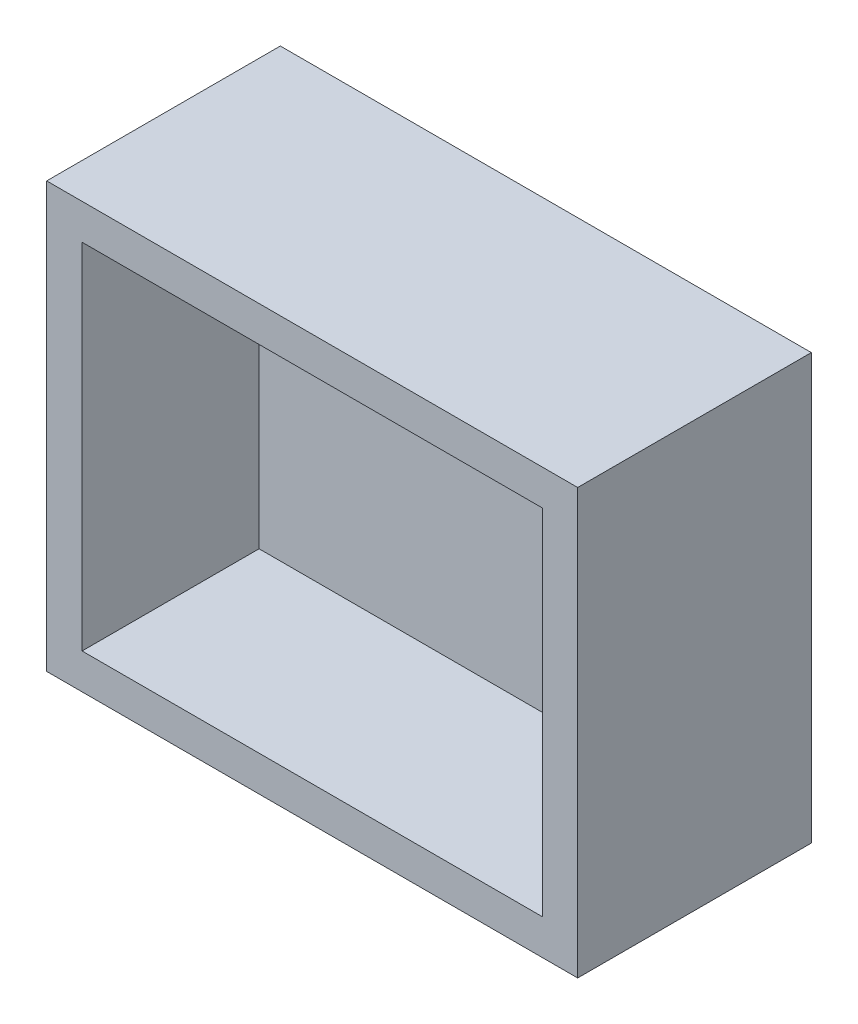
ISO-10303-21;
HEADER;
FILE_DESCRIPTION(('STEP AP214'),'2;1');
FILE_NAME('part.step','',(''),(''),'','','');
FILE_SCHEMA(('AUTOMOTIVE_DESIGN { 1 0 10303 214 1 1 1 1 }'));
ENDSEC;
DATA;
#1=APPLICATION_CONTEXT('core data for automotive mechanical design processes');
#2=APPLICATION_PROTOCOL_DEFINITION('international standard','automotive_design',2000,#1);
#3=PRODUCT_CONTEXT('',#1,'mechanical');
#4=PRODUCT('Part','Part','',(#3));
#5=PRODUCT_RELATED_PRODUCT_CATEGORY('part','',(#4));
#6=PRODUCT_DEFINITION_FORMATION('','',#4);
#7=PRODUCT_DEFINITION_CONTEXT('part definition',#1,'design');
#8=PRODUCT_DEFINITION('design','',#6,#7);
#9=PRODUCT_DEFINITION_SHAPE('','',#8);
#10=(LENGTH_UNIT() NAMED_UNIT(*) SI_UNIT(.MILLI.,.METRE.));
#11=(NAMED_UNIT(*) PLANE_ANGLE_UNIT() SI_UNIT($,.RADIAN.));
#12=(NAMED_UNIT(*) SI_UNIT($,.STERADIAN.) SOLID_ANGLE_UNIT());
#13=UNCERTAINTY_MEASURE_WITH_UNIT(LENGTH_MEASURE(1.E-05),#10,'distance_accuracy_value','');
#14=(GEOMETRIC_REPRESENTATION_CONTEXT(3) GLOBAL_UNCERTAINTY_ASSIGNED_CONTEXT((#13)) GLOBAL_UNIT_ASSIGNED_CONTEXT((#10,
#11,#12)) REPRESENTATION_CONTEXT('',''));
#15=CARTESIAN_POINT('',(0.,0.,0.));
#16=DIRECTION('',(0.,0.,1.));
#17=DIRECTION('',(1.,0.,0.));
#18=AXIS2_PLACEMENT_3D('',#15,#16,#17);
#19=CARTESIAN_POINT('',(0.,0.,-8.));
#20=DIRECTION('',(0.,0.,-1.));
#21=DIRECTION('',(-1.,0.,0.));
#22=AXIS2_PLACEMENT_3D('',#19,#20,#21);
#23=PLANE('',#22);
#24=CARTESIAN_POINT('',(24.,17.5,-8.));
#25=DIRECTION('',(0.,0.,-1.));
#26=DIRECTION('',(-1.,0.,0.));
#27=AXIS2_PLACEMENT_3D('',#24,#25,#26);
#28=CIRCLE('',#27,2.7);
#29=CARTESIAN_POINT('',(21.3,17.5,-8.));
#30=VERTEX_POINT('',#29);
#31=EDGE_CURVE('E358',#30,#30,#28,.T.);
#32=ORIENTED_EDGE('',*,*,#31,.F.);
#33=EDGE_LOOP('',(#32));
#34=FACE_BOUND('',#33,.T.);
#35=CARTESIAN_POINT('',(24.,7.5,-8.));
#36=DIRECTION('',(0.,0.,-1.));
#37=DIRECTION('',(-1.,0.,0.));
#38=AXIS2_PLACEMENT_3D('',#35,#36,#37);
#39=CIRCLE('',#38,2.7);
#40=CARTESIAN_POINT('',(21.3,7.5,-8.));
#41=VERTEX_POINT('',#40);
#42=EDGE_CURVE('E328',#41,#41,#39,.T.);
#43=ORIENTED_EDGE('',*,*,#42,.F.);
#44=EDGE_LOOP('',(#43));
#45=FACE_BOUND('',#44,.T.);
#46=CARTESIAN_POINT('',(-24.,17.5,-8.));
#47=DIRECTION('',(0.,0.,1.));
#48=DIRECTION('',(1.,0.,0.));
#49=AXIS2_PLACEMENT_3D('',#46,#47,#48);
#50=CIRCLE('',#49,2.7);
#51=CARTESIAN_POINT('',(-21.3,17.5,-8.));
#52=VERTEX_POINT('',#51);
#53=EDGE_CURVE('E303',#52,#52,#50,.T.);
#54=ORIENTED_EDGE('',*,*,#53,.T.);
#55=EDGE_LOOP('',(#54));
#56=FACE_BOUND('',#55,.T.);
#57=CARTESIAN_POINT('',(-24.,7.5,-8.));
#58=DIRECTION('',(0.,0.,1.));
#59=DIRECTION('',(1.,0.,0.));
#60=AXIS2_PLACEMENT_3D('',#57,#58,#59);
#61=CIRCLE('',#60,2.7);
#62=CARTESIAN_POINT('',(-21.3,7.5,-8.));
#63=VERTEX_POINT('',#62);
#64=EDGE_CURVE('E320',#63,#63,#61,.T.);
#65=ORIENTED_EDGE('',*,*,#64,.T.);
#66=EDGE_LOOP('',(#65));
#67=FACE_BOUND('',#66,.T.);
#68=DIRECTION('',(0.,1.,0.));
#69=VECTOR('',#68,1.);
#70=CARTESIAN_POINT('',(37.5,-30.,-8.));
#71=LINE('',#70,#69);
#72=CARTESIAN_POINT('',(37.5,-30.,-8.));
#73=VERTEX_POINT('',#72);
#74=CARTESIAN_POINT('',(37.5,30.,-8.));
#75=VERTEX_POINT('',#74);
#76=EDGE_CURVE('E218',#73,#75,#71,.T.);
#77=ORIENTED_EDGE('',*,*,#76,.F.);
#78=DIRECTION('',(1.,0.,0.));
#79=VECTOR('',#78,1.);
#80=CARTESIAN_POINT('',(-37.5,-30.,-8.));
#81=LINE('',#80,#79);
#82=CARTESIAN_POINT('',(-37.5,-30.,-8.));
#83=VERTEX_POINT('',#82);
#84=EDGE_CURVE('E207',#83,#73,#81,.T.);
#85=ORIENTED_EDGE('',*,*,#84,.F.);
#86=DIRECTION('',(0.,-1.,0.));
#87=VECTOR('',#86,1.);
#88=CARTESIAN_POINT('',(-37.5,-30.,-8.));
#89=LINE('',#88,#87);
#90=CARTESIAN_POINT('',(-37.5,30.,-8.));
#91=VERTEX_POINT('',#90);
#92=EDGE_CURVE('E194',#91,#83,#89,.T.);
#93=ORIENTED_EDGE('',*,*,#92,.F.);
#94=DIRECTION('',(-1.,0.,0.));
#95=VECTOR('',#94,1.);
#96=CARTESIAN_POINT('',(-37.5,30.,-8.));
#97=LINE('',#96,#95);
#98=EDGE_CURVE('E212',#75,#91,#97,.T.);
#99=ORIENTED_EDGE('',*,*,#98,.F.);
#100=EDGE_LOOP('',(#77,#85,#93,#99));
#101=FACE_BOUND('',#100,.T.);
#102=DIRECTION('',(0.,-1.,0.));
#103=VECTOR('',#102,1.);
#104=CARTESIAN_POINT('',(28.5,11.25,-8.));
#105=LINE('',#104,#103);
#106=CARTESIAN_POINT('',(28.5,13.75,-8.));
#107=VERTEX_POINT('',#106);
#108=CARTESIAN_POINT('',(28.5,11.25,-8.));
#109=VERTEX_POINT('',#108);
#110=EDGE_CURVE('E361',#107,#109,#105,.T.);
#111=ORIENTED_EDGE('',*,*,#110,.F.);
#112=DIRECTION('',(1.,0.,0.));
#113=VECTOR('',#112,1.);
#114=CARTESIAN_POINT('',(28.5,13.75,-8.));
#115=LINE('',#114,#113);
#116=CARTESIAN_POINT('',(20.,13.75,-8.));
#117=VERTEX_POINT('',#116);
#118=EDGE_CURVE('E337',#117,#107,#115,.T.);
#119=ORIENTED_EDGE('',*,*,#118,.F.);
#120=DIRECTION('',(0.,1.,0.));
#121=VECTOR('',#120,1.);
#122=CARTESIAN_POINT('',(20.,22.5,-8.));
#123=LINE('',#122,#121);
#124=CARTESIAN_POINT('',(20.,22.5,-8.));
#125=VERTEX_POINT('',#124);
#126=EDGE_CURVE('E264',#117,#125,#123,.T.);
#127=ORIENTED_EDGE('',*,*,#126,.T.);
#128=DIRECTION('',(-1.,0.,0.));
#129=VECTOR('',#128,1.);
#130=CARTESIAN_POINT('',(-20.,22.5,-8.));
#131=LINE('',#130,#129);
#132=CARTESIAN_POINT('',(-20.,22.5,-8.));
#133=VERTEX_POINT('',#132);
#134=EDGE_CURVE('E227',#125,#133,#131,.T.);
#135=ORIENTED_EDGE('',*,*,#134,.T.);
#136=DIRECTION('',(0.,-1.,0.));
#137=VECTOR('',#136,1.);
#138=CARTESIAN_POINT('',(-20.,22.5,-8.));
#139=LINE('',#138,#137);
#140=CARTESIAN_POINT('',(-20.,13.75,-8.));
#141=VERTEX_POINT('',#140);
#142=EDGE_CURVE('E269',#133,#141,#139,.T.);
#143=ORIENTED_EDGE('',*,*,#142,.T.);
#144=DIRECTION('',(-1.,0.,0.));
#145=VECTOR('',#144,1.);
#146=CARTESIAN_POINT('',(-28.5,13.75,-8.));
#147=LINE('',#146,#145);
#148=CARTESIAN_POINT('',(-28.5,13.75,-8.));
#149=VERTEX_POINT('',#148);
#150=EDGE_CURVE('E294',#141,#149,#147,.T.);
#151=ORIENTED_EDGE('',*,*,#150,.T.);
#152=DIRECTION('',(0.,-1.,0.));
#153=VECTOR('',#152,1.);
#154=CARTESIAN_POINT('',(-28.5,11.25,-8.));
#155=LINE('',#154,#153);
#156=CARTESIAN_POINT('',(-28.5,11.25,-8.));
#157=VERTEX_POINT('',#156);
#158=EDGE_CURVE('E307',#149,#157,#155,.T.);
#159=ORIENTED_EDGE('',*,*,#158,.T.);
#160=DIRECTION('',(1.,0.,0.));
#161=VECTOR('',#160,1.);
#162=CARTESIAN_POINT('',(-20.,11.25,-8.));
#163=LINE('',#162,#161);
#164=CARTESIAN_POINT('',(-20.,11.25,-8.));
#165=VERTEX_POINT('',#164);
#166=EDGE_CURVE('E278',#157,#165,#163,.T.);
#167=ORIENTED_EDGE('',*,*,#166,.T.);
#168=CARTESIAN_POINT('',(-20.,2.5,-8.));
#169=VERTEX_POINT('',#168);
#170=EDGE_CURVE('E242',#165,#169,#139,.T.);
#171=ORIENTED_EDGE('',*,*,#170,.T.);
#172=DIRECTION('',(1.,0.,0.));
#173=VECTOR('',#172,1.);
#174=CARTESIAN_POINT('',(-20.,2.5,-8.));
#175=LINE('',#174,#173);
#176=CARTESIAN_POINT('',(20.,2.5,-8.));
#177=VERTEX_POINT('',#176);
#178=EDGE_CURVE('E265',#169,#177,#175,.T.);
#179=ORIENTED_EDGE('',*,*,#178,.T.);
#180=CARTESIAN_POINT('',(20.,11.25,-8.));
#181=VERTEX_POINT('',#180);
#182=EDGE_CURVE('E260',#177,#181,#123,.T.);
#183=ORIENTED_EDGE('',*,*,#182,.T.);
#184=DIRECTION('',(-1.,0.,0.));
#185=VECTOR('',#184,1.);
#186=CARTESIAN_POINT('',(20.,11.25,-8.));
#187=LINE('',#186,#185);
#188=EDGE_CURVE('E351',#109,#181,#187,.T.);
#189=ORIENTED_EDGE('',*,*,#188,.F.);
#190=EDGE_LOOP('',(#111,#119,#127,#135,#143,#151,#159,#167,#171,#179,#183,#189));
#191=FACE_BOUND('',#190,.T.);
#192=ADVANCED_FACE('F39',(#34,#45,#56,#67,#101,#191),#23,.T.);
#193=CARTESIAN_POINT('',(20.,22.5,-8.));
#194=DIRECTION('',(1.,0.,0.));
#195=DIRECTION('',(0.,1.,0.));
#196=AXIS2_PLACEMENT_3D('',#193,#194,#195);
#197=PLANE('',#196);
#198=DIRECTION('',(0.,0.,1.));
#199=VECTOR('',#198,1.);
#200=CARTESIAN_POINT('',(20.,13.75,-8.));
#201=LINE('',#200,#199);
#202=CARTESIAN_POINT('',(20.,13.75,0.));
#203=VERTEX_POINT('',#202);
#204=EDGE_CURVE('E324',#117,#203,#201,.T.);
#205=ORIENTED_EDGE('',*,*,#204,.T.);
#206=DIRECTION('',(0.,1.,0.));
#207=VECTOR('',#206,1.);
#208=CARTESIAN_POINT('',(20.,22.5,0.));
#209=LINE('',#208,#207);
#210=CARTESIAN_POINT('',(20.,22.5,0.));
#211=VERTEX_POINT('',#210);
#212=EDGE_CURVE('E247',#203,#211,#209,.T.);
#213=ORIENTED_EDGE('',*,*,#212,.T.);
#214=DIRECTION('',(0.,0.,1.));
#215=VECTOR('',#214,1.);
#216=CARTESIAN_POINT('',(20.,22.5,-8.));
#217=LINE('',#216,#215);
#218=EDGE_CURVE('E231',#125,#211,#217,.T.);
#219=ORIENTED_EDGE('',*,*,#218,.F.);
#220=ORIENTED_EDGE('',*,*,#126,.F.);
#221=EDGE_LOOP('',(#205,#213,#219,#220));
#222=FACE_BOUND('',#221,.T.);
#223=ADVANCED_FACE('F437',(#222),#197,.F.);
#224=DIRECTION('',(0.,0.,1.));
#225=VECTOR('',#224,1.);
#226=CARTESIAN_POINT('',(20.,11.25,-8.));
#227=LINE('',#226,#225);
#228=CARTESIAN_POINT('',(20.,11.25,0.));
#229=VERTEX_POINT('',#228);
#230=EDGE_CURVE('E332',#181,#229,#227,.T.);
#231=ORIENTED_EDGE('',*,*,#230,.F.);
#232=ORIENTED_EDGE('',*,*,#182,.F.);
#233=DIRECTION('',(0.,0.,1.));
#234=VECTOR('',#233,1.);
#235=CARTESIAN_POINT('',(20.,2.5,-8.));
#236=LINE('',#235,#234);
#237=CARTESIAN_POINT('',(20.,2.5,0.));
#238=VERTEX_POINT('',#237);
#239=EDGE_CURVE('E226',#177,#238,#236,.T.);
#240=ORIENTED_EDGE('',*,*,#239,.T.);
#241=EDGE_CURVE('E243',#238,#229,#209,.T.);
#242=ORIENTED_EDGE('',*,*,#241,.T.);
#243=EDGE_LOOP('',(#231,#232,#240,#242));
#244=FACE_BOUND('',#243,.T.);
#245=ADVANCED_FACE('F463',(#244),#197,.F.);
#246=CARTESIAN_POINT('',(-20.,22.5,-8.));
#247=DIRECTION('',(-1.,0.,0.));
#248=DIRECTION('',(0.,-1.,0.));
#249=AXIS2_PLACEMENT_3D('',#246,#247,#248);
#250=PLANE('',#249);
#251=ORIENTED_EDGE('',*,*,#170,.F.);
#252=DIRECTION('',(0.,0.,1.));
#253=VECTOR('',#252,1.);
#254=CARTESIAN_POINT('',(-20.,11.25,-8.));
#255=LINE('',#254,#253);
#256=CARTESIAN_POINT('',(-20.,11.25,0.));
#257=VERTEX_POINT('',#256);
#258=EDGE_CURVE('E286',#165,#257,#255,.T.);
#259=ORIENTED_EDGE('',*,*,#258,.T.);
#260=DIRECTION('',(0.,-1.,0.));
#261=VECTOR('',#260,1.);
#262=CARTESIAN_POINT('',(-20.,22.5,0.));
#263=LINE('',#262,#261);
#264=CARTESIAN_POINT('',(-20.,2.5,0.));
#265=VERTEX_POINT('',#264);
#266=EDGE_CURVE('E256',#257,#265,#263,.T.);
#267=ORIENTED_EDGE('',*,*,#266,.T.);
#268=DIRECTION('',(0.,0.,1.));
#269=VECTOR('',#268,1.);
#270=CARTESIAN_POINT('',(-20.,2.5,-8.));
#271=LINE('',#270,#269);
#272=EDGE_CURVE('E222',#169,#265,#271,.T.);
#273=ORIENTED_EDGE('',*,*,#272,.F.);
#274=EDGE_LOOP('',(#251,#259,#267,#273));
#275=FACE_BOUND('',#274,.T.);
#276=ADVANCED_FACE('F455',(#275),#250,.F.);
#277=CARTESIAN_POINT('',(37.5,-30.,-8.));
#278=DIRECTION('',(1.,0.,0.));
#279=DIRECTION('',(0.,0.,-1.));
#280=AXIS2_PLACEMENT_3D('',#277,#278,#279);
#281=PLANE('',#280);
#282=DIRECTION('',(0.,1.,0.));
#283=VECTOR('',#282,1.);
#284=CARTESIAN_POINT('',(37.5,30.,25.));
#285=LINE('',#284,#283);
#286=CARTESIAN_POINT('',(37.5,-30.,25.));
#287=VERTEX_POINT('',#286);
#288=CARTESIAN_POINT('',(37.5,30.,25.));
#289=VERTEX_POINT('',#288);
#290=EDGE_CURVE('E55',#287,#289,#285,.T.);
#291=ORIENTED_EDGE('',*,*,#290,.F.);
#292=DIRECTION('',(0.,0.,1.));
#293=VECTOR('',#292,1.);
#294=CARTESIAN_POINT('',(37.5,-30.,-8.));
#295=LINE('',#294,#293);
#296=EDGE_CURVE('E48',#73,#287,#295,.T.);
#297=ORIENTED_EDGE('',*,*,#296,.F.);
#298=ORIENTED_EDGE('',*,*,#76,.T.);
#299=DIRECTION('',(0.,0.,1.));
#300=VECTOR('',#299,1.);
#301=CARTESIAN_POINT('',(37.5,30.,-8.));
#302=LINE('',#301,#300);
#303=EDGE_CURVE('E202',#75,#289,#302,.T.);
#304=ORIENTED_EDGE('',*,*,#303,.T.);
#305=EDGE_LOOP('',(#291,#297,#298,#304));
#306=FACE_BOUND('',#305,.T.);
#307=ADVANCED_FACE('F41',(#306),#281,.T.);
#308=CARTESIAN_POINT('',(-37.5,-30.,-8.));
#309=DIRECTION('',(0.,-1.,0.));
#310=DIRECTION('',(0.,0.,-1.));
#311=AXIS2_PLACEMENT_3D('',#308,#309,#310);
#312=PLANE('',#311);
#313=DIRECTION('',(1.,0.,0.));
#314=VECTOR('',#313,1.);
#315=CARTESIAN_POINT('',(-98.3276253029822,-30.,25.));
#316=LINE('',#315,#314);
#317=CARTESIAN_POINT('',(-37.5,-30.,25.));
#318=VERTEX_POINT('',#317);
#319=EDGE_CURVE('E177',#318,#287,#316,.T.);
#320=ORIENTED_EDGE('',*,*,#319,.F.);
#321=DIRECTION('',(0.,0.,1.));
#322=VECTOR('',#321,1.);
#323=CARTESIAN_POINT('',(-37.5,-30.,-8.));
#324=LINE('',#323,#322);
#325=EDGE_CURVE('E188',#83,#318,#324,.T.);
#326=ORIENTED_EDGE('',*,*,#325,.F.);
#327=ORIENTED_EDGE('',*,*,#84,.T.);
#328=ORIENTED_EDGE('',*,*,#296,.T.);
#329=EDGE_LOOP('',(#320,#326,#327,#328));
#330=FACE_BOUND('',#329,.T.);
#331=ADVANCED_FACE('F186',(#330),#312,.T.);
#332=CARTESIAN_POINT('',(-37.5,-30.,-8.));
#333=DIRECTION('',(-1.,0.,0.));
#334=DIRECTION('',(0.,0.,1.));
#335=AXIS2_PLACEMENT_3D('',#332,#333,#334);
#336=PLANE('',#335);
#337=DIRECTION('',(0.,1.,0.));
#338=VECTOR('',#337,1.);
#339=CARTESIAN_POINT('',(-37.5,30.,25.));
#340=LINE('',#339,#338);
#341=CARTESIAN_POINT('',(-37.5,30.,25.));
#342=VERTEX_POINT('',#341);
#343=EDGE_CURVE('E174',#318,#342,#340,.T.);
#344=ORIENTED_EDGE('',*,*,#343,.T.);
#345=DIRECTION('',(0.,0.,1.));
#346=VECTOR('',#345,1.);
#347=CARTESIAN_POINT('',(-37.5,30.,-8.));
#348=LINE('',#347,#346);
#349=EDGE_CURVE('E197',#91,#342,#348,.T.);
#350=ORIENTED_EDGE('',*,*,#349,.F.);
#351=ORIENTED_EDGE('',*,*,#92,.T.);
#352=ORIENTED_EDGE('',*,*,#325,.T.);
#353=EDGE_LOOP('',(#344,#350,#351,#352));
#354=FACE_BOUND('',#353,.T.);
#355=ADVANCED_FACE('F192',(#354),#336,.T.);
#356=CARTESIAN_POINT('',(-37.5,30.,-8.));
#357=DIRECTION('',(0.,1.,0.));
#358=DIRECTION('',(0.,0.,1.));
#359=AXIS2_PLACEMENT_3D('',#356,#357,#358);
#360=PLANE('',#359);
#361=DIRECTION('',(1.,0.,0.));
#362=VECTOR('',#361,1.);
#363=CARTESIAN_POINT('',(-98.3276253029822,30.,25.));
#364=LINE('',#363,#362);
#365=EDGE_CURVE('E178',#342,#289,#364,.T.);
#366=ORIENTED_EDGE('',*,*,#365,.T.);
#367=ORIENTED_EDGE('',*,*,#303,.F.);
#368=ORIENTED_EDGE('',*,*,#98,.T.);
#369=ORIENTED_EDGE('',*,*,#349,.T.);
#370=EDGE_LOOP('',(#366,#367,#368,#369));
#371=FACE_BOUND('',#370,.T.);
#372=ADVANCED_FACE('F519',(#371),#360,.T.);
#373=CARTESIAN_POINT('',(-20.,22.5,0.));
#374=VERTEX_POINT('',#373);
#375=CARTESIAN_POINT('',(-20.,13.75,0.));
#376=VERTEX_POINT('',#375);
#377=EDGE_CURVE('E252',#374,#376,#263,.T.);
#378=ORIENTED_EDGE('',*,*,#377,.T.);
#379=DIRECTION('',(0.,0.,1.));
#380=VECTOR('',#379,1.);
#381=CARTESIAN_POINT('',(-20.,13.75,-8.));
#382=LINE('',#381,#380);
#383=EDGE_CURVE('E273',#141,#376,#382,.T.);
#384=ORIENTED_EDGE('',*,*,#383,.F.);
#385=ORIENTED_EDGE('',*,*,#142,.F.);
#386=DIRECTION('',(0.,0.,1.));
#387=VECTOR('',#386,1.);
#388=CARTESIAN_POINT('',(-20.,22.5,-8.));
#389=LINE('',#388,#387);
#390=EDGE_CURVE('E221',#133,#374,#389,.T.);
#391=ORIENTED_EDGE('',*,*,#390,.T.);
#392=EDGE_LOOP('',(#378,#384,#385,#391));
#393=FACE_BOUND('',#392,.T.);
#394=ADVANCED_FACE('F443',(#393),#250,.F.);
#395=CARTESIAN_POINT('',(-20.,22.5,-8.));
#396=DIRECTION('',(0.,1.,0.));
#397=DIRECTION('',(0.,0.,1.));
#398=AXIS2_PLACEMENT_3D('',#395,#396,#397);
#399=PLANE('',#398);
#400=DIRECTION('',(-1.,0.,0.));
#401=VECTOR('',#400,1.);
#402=CARTESIAN_POINT('',(-20.,22.5,0.));
#403=LINE('',#402,#401);
#404=EDGE_CURVE('E238',#211,#374,#403,.T.);
#405=ORIENTED_EDGE('',*,*,#404,.T.);
#406=ORIENTED_EDGE('',*,*,#390,.F.);
#407=ORIENTED_EDGE('',*,*,#134,.F.);
#408=ORIENTED_EDGE('',*,*,#218,.T.);
#409=EDGE_LOOP('',(#405,#406,#407,#408));
#410=FACE_BOUND('',#409,.T.);
#411=ADVANCED_FACE('F439',(#410),#399,.F.);
#412=CARTESIAN_POINT('',(-20.,2.5,-8.));
#413=DIRECTION('',(0.,-1.,0.));
#414=DIRECTION('',(0.,0.,-1.));
#415=AXIS2_PLACEMENT_3D('',#412,#413,#414);
#416=PLANE('',#415);
#417=DIRECTION('',(1.,0.,0.));
#418=VECTOR('',#417,1.);
#419=CARTESIAN_POINT('',(-20.,2.5,0.));
#420=LINE('',#419,#418);
#421=EDGE_CURVE('E248',#265,#238,#420,.T.);
#422=ORIENTED_EDGE('',*,*,#421,.T.);
#423=ORIENTED_EDGE('',*,*,#239,.F.);
#424=ORIENTED_EDGE('',*,*,#178,.F.);
#425=ORIENTED_EDGE('',*,*,#272,.T.);
#426=EDGE_LOOP('',(#422,#423,#424,#425));
#427=FACE_BOUND('',#426,.T.);
#428=ADVANCED_FACE('F459',(#427),#416,.F.);
#429=CARTESIAN_POINT('',(-20.,11.25,-8.));
#430=DIRECTION('',(0.,-1.,0.));
#431=DIRECTION('',(0.,0.,-1.));
#432=AXIS2_PLACEMENT_3D('',#429,#430,#431);
#433=PLANE('',#432);
#434=DIRECTION('',(1.,0.,0.));
#435=VECTOR('',#434,1.);
#436=CARTESIAN_POINT('',(-20.,11.25,0.));
#437=LINE('',#436,#435);
#438=CARTESIAN_POINT('',(-28.5,11.25,0.));
#439=VERTEX_POINT('',#438);
#440=EDGE_CURVE('E290',#439,#257,#437,.T.);
#441=ORIENTED_EDGE('',*,*,#440,.T.);
#442=ORIENTED_EDGE('',*,*,#258,.F.);
#443=ORIENTED_EDGE('',*,*,#166,.F.);
#444=DIRECTION('',(0.,0.,1.));
#445=VECTOR('',#444,1.);
#446=CARTESIAN_POINT('',(-28.5,11.25,-8.));
#447=LINE('',#446,#445);
#448=EDGE_CURVE('E282',#157,#439,#447,.T.);
#449=ORIENTED_EDGE('',*,*,#448,.T.);
#450=EDGE_LOOP('',(#441,#442,#443,#449));
#451=FACE_BOUND('',#450,.T.);
#452=ADVANCED_FACE('F451',(#451),#433,.F.);
#453=CARTESIAN_POINT('',(-28.5,11.25,-8.));
#454=DIRECTION('',(-1.,0.,0.));
#455=DIRECTION('',(0.,0.,1.));
#456=AXIS2_PLACEMENT_3D('',#453,#454,#455);
#457=PLANE('',#456);
#458=DIRECTION('',(0.,-1.,0.));
#459=VECTOR('',#458,1.);
#460=CARTESIAN_POINT('',(-28.5,11.25,0.));
#461=LINE('',#460,#459);
#462=CARTESIAN_POINT('',(-28.5,13.75,0.));
#463=VERTEX_POINT('',#462);
#464=EDGE_CURVE('E295',#463,#439,#461,.T.);
#465=ORIENTED_EDGE('',*,*,#464,.T.);
#466=ORIENTED_EDGE('',*,*,#448,.F.);
#467=ORIENTED_EDGE('',*,*,#158,.F.);
#468=DIRECTION('',(0.,0.,1.));
#469=VECTOR('',#468,1.);
#470=CARTESIAN_POINT('',(-28.5,13.75,-8.));
#471=LINE('',#470,#469);
#472=EDGE_CURVE('E277',#149,#463,#471,.T.);
#473=ORIENTED_EDGE('',*,*,#472,.T.);
#474=EDGE_LOOP('',(#465,#466,#467,#473));
#475=FACE_BOUND('',#474,.T.);
#476=ADVANCED_FACE('F448',(#475),#457,.F.);
#477=CARTESIAN_POINT('',(-28.5,13.75,-8.));
#478=DIRECTION('',(0.,1.,0.));
#479=DIRECTION('',(0.,0.,1.));
#480=AXIS2_PLACEMENT_3D('',#477,#478,#479);
#481=PLANE('',#480);
#482=DIRECTION('',(-1.,0.,0.));
#483=VECTOR('',#482,1.);
#484=CARTESIAN_POINT('',(-28.5,13.75,0.));
#485=LINE('',#484,#483);
#486=EDGE_CURVE('E299',#376,#463,#485,.T.);
#487=ORIENTED_EDGE('',*,*,#486,.T.);
#488=ORIENTED_EDGE('',*,*,#472,.F.);
#489=ORIENTED_EDGE('',*,*,#150,.F.);
#490=ORIENTED_EDGE('',*,*,#383,.T.);
#491=EDGE_LOOP('',(#487,#488,#489,#490));
#492=FACE_BOUND('',#491,.T.);
#493=ADVANCED_FACE('F446',(#492),#481,.F.);
#494=CARTESIAN_POINT('',(-24.,7.5,-8.));
#495=DIRECTION('',(0.,0.,1.));
#496=DIRECTION('',(1.,0.,0.));
#497=AXIS2_PLACEMENT_3D('',#494,#495,#496);
#498=CYLINDRICAL_SURFACE('',#497,2.7);
#499=ORIENTED_EDGE('',*,*,#64,.F.);
#500=EDGE_LOOP('',(#499));
#501=FACE_BOUND('',#500,.T.);
#502=CARTESIAN_POINT('',(-24.,7.5,0.));
#503=DIRECTION('',(0.,0.,1.));
#504=DIRECTION('',(1.,0.,0.));
#505=AXIS2_PLACEMENT_3D('',#502,#503,#504);
#506=CIRCLE('',#505,2.7);
#507=CARTESIAN_POINT('',(-21.3,7.5,0.));
#508=VERTEX_POINT('',#507);
#509=EDGE_CURVE('E314',#508,#508,#506,.T.);
#510=ORIENTED_EDGE('',*,*,#509,.T.);
#511=EDGE_LOOP('',(#510));
#512=FACE_BOUND('',#511,.T.);
#513=ADVANCED_FACE('F595',(#501,#512),#498,.F.);
#514=CARTESIAN_POINT('',(-24.,17.5,-8.));
#515=DIRECTION('',(0.,0.,1.));
#516=DIRECTION('',(1.,0.,0.));
#517=AXIS2_PLACEMENT_3D('',#514,#515,#516);
#518=CYLINDRICAL_SURFACE('',#517,2.7);
#519=ORIENTED_EDGE('',*,*,#53,.F.);
#520=EDGE_LOOP('',(#519));
#521=FACE_BOUND('',#520,.T.);
#522=CARTESIAN_POINT('',(-24.,17.5,0.));
#523=DIRECTION('',(0.,0.,1.));
#524=DIRECTION('',(1.,0.,0.));
#525=AXIS2_PLACEMENT_3D('',#522,#523,#524);
#526=CIRCLE('',#525,2.7);
#527=CARTESIAN_POINT('',(-21.3,17.5,0.));
#528=VERTEX_POINT('',#527);
#529=EDGE_CURVE('E318',#528,#528,#526,.T.);
#530=ORIENTED_EDGE('',*,*,#529,.T.);
#531=EDGE_LOOP('',(#530));
#532=FACE_BOUND('',#531,.T.);
#533=ADVANCED_FACE('F591',(#521,#532),#518,.F.);
#534=CARTESIAN_POINT('',(28.5,13.75,-8.));
#535=DIRECTION('',(0.,-1.,0.));
#536=DIRECTION('',(0.,0.,-1.));
#537=AXIS2_PLACEMENT_3D('',#534,#535,#536);
#538=PLANE('',#537);
#539=DIRECTION('',(1.,0.,0.));
#540=VECTOR('',#539,1.);
#541=CARTESIAN_POINT('',(28.5,13.75,0.));
#542=LINE('',#541,#540);
#543=CARTESIAN_POINT('',(28.5,13.75,0.));
#544=VERTEX_POINT('',#543);
#545=EDGE_CURVE('E348',#203,#544,#542,.T.);
#546=ORIENTED_EDGE('',*,*,#545,.F.);
#547=ORIENTED_EDGE('',*,*,#204,.F.);
#548=ORIENTED_EDGE('',*,*,#118,.T.);
#549=DIRECTION('',(0.,0.,1.));
#550=VECTOR('',#549,1.);
#551=CARTESIAN_POINT('',(28.5,13.75,-8.));
#552=LINE('',#551,#550);
#553=EDGE_CURVE('E341',#107,#544,#552,.T.);
#554=ORIENTED_EDGE('',*,*,#553,.T.);
#555=EDGE_LOOP('',(#546,#547,#548,#554));
#556=FACE_BOUND('',#555,.T.);
#557=ADVANCED_FACE('F474',(#556),#538,.T.);
#558=CARTESIAN_POINT('',(28.5,11.25,-8.));
#559=DIRECTION('',(-1.,0.,0.));
#560=DIRECTION('',(0.,0.,1.));
#561=AXIS2_PLACEMENT_3D('',#558,#559,#560);
#562=PLANE('',#561);
#563=DIRECTION('',(0.,-1.,0.));
#564=VECTOR('',#563,1.);
#565=CARTESIAN_POINT('',(28.5,11.25,0.));
#566=LINE('',#565,#564);
#567=CARTESIAN_POINT('',(28.5,11.25,0.));
#568=VERTEX_POINT('',#567);
#569=EDGE_CURVE('E352',#544,#568,#566,.T.);
#570=ORIENTED_EDGE('',*,*,#569,.F.);
#571=ORIENTED_EDGE('',*,*,#553,.F.);
#572=ORIENTED_EDGE('',*,*,#110,.T.);
#573=DIRECTION('',(0.,0.,1.));
#574=VECTOR('',#573,1.);
#575=CARTESIAN_POINT('',(28.5,11.25,-8.));
#576=LINE('',#575,#574);
#577=EDGE_CURVE('E336',#109,#568,#576,.T.);
#578=ORIENTED_EDGE('',*,*,#577,.T.);
#579=EDGE_LOOP('',(#570,#571,#572,#578));
#580=FACE_BOUND('',#579,.T.);
#581=ADVANCED_FACE('F470',(#580),#562,.T.);
#582=CARTESIAN_POINT('',(20.,11.25,-8.));
#583=DIRECTION('',(0.,1.,0.));
#584=DIRECTION('',(0.,0.,1.));
#585=AXIS2_PLACEMENT_3D('',#582,#583,#584);
#586=PLANE('',#585);
#587=DIRECTION('',(-1.,0.,0.));
#588=VECTOR('',#587,1.);
#589=CARTESIAN_POINT('',(20.,11.25,0.));
#590=LINE('',#589,#588);
#591=EDGE_CURVE('E355',#568,#229,#590,.T.);
#592=ORIENTED_EDGE('',*,*,#591,.F.);
#593=ORIENTED_EDGE('',*,*,#577,.F.);
#594=ORIENTED_EDGE('',*,*,#188,.T.);
#595=ORIENTED_EDGE('',*,*,#230,.T.);
#596=EDGE_LOOP('',(#592,#593,#594,#595));
#597=FACE_BOUND('',#596,.T.);
#598=ADVANCED_FACE('F466',(#597),#586,.T.);
#599=CARTESIAN_POINT('',(24.,7.5,-8.));
#600=DIRECTION('',(0.,0.,1.));
#601=DIRECTION('',(1.,0.,0.));
#602=AXIS2_PLACEMENT_3D('',#599,#600,#601);
#603=CYLINDRICAL_SURFACE('',#602,2.7);
#604=ORIENTED_EDGE('',*,*,#42,.T.);
#605=EDGE_LOOP('',(#604));
#606=FACE_BOUND('',#605,.T.);
#607=CARTESIAN_POINT('',(24.,7.5,0.));
#608=DIRECTION('',(0.,0.,-1.));
#609=DIRECTION('',(-1.,0.,0.));
#610=AXIS2_PLACEMENT_3D('',#607,#608,#609);
#611=CIRCLE('',#610,2.7);
#612=CARTESIAN_POINT('',(21.3,7.5,0.));
#613=VERTEX_POINT('',#612);
#614=EDGE_CURVE('E319',#613,#613,#611,.T.);
#615=ORIENTED_EDGE('',*,*,#614,.F.);
#616=EDGE_LOOP('',(#615));
#617=FACE_BOUND('',#616,.T.);
#618=ADVANCED_FACE('F492',(#606,#617),#603,.F.);
#619=CARTESIAN_POINT('',(24.,17.5,-8.));
#620=DIRECTION('',(0.,0.,1.));
#621=DIRECTION('',(1.,0.,0.));
#622=AXIS2_PLACEMENT_3D('',#619,#620,#621);
#623=CYLINDRICAL_SURFACE('',#622,2.7);
#624=ORIENTED_EDGE('',*,*,#31,.T.);
#625=EDGE_LOOP('',(#624));
#626=FACE_BOUND('',#625,.T.);
#627=CARTESIAN_POINT('',(24.,17.5,0.));
#628=DIRECTION('',(0.,0.,-1.));
#629=DIRECTION('',(-1.,0.,0.));
#630=AXIS2_PLACEMENT_3D('',#627,#628,#629);
#631=CIRCLE('',#630,2.7);
#632=CARTESIAN_POINT('',(21.3,17.5,0.));
#633=VERTEX_POINT('',#632);
#634=EDGE_CURVE('E369',#633,#633,#631,.T.);
#635=ORIENTED_EDGE('',*,*,#634,.F.);
#636=EDGE_LOOP('',(#635));
#637=FACE_BOUND('',#636,.T.);
#638=ADVANCED_FACE('F480',(#626,#637),#623,.F.);
#639=CARTESIAN_POINT('',(0.,0.,0.));
#640=DIRECTION('',(0.,0.,1.));
#641=DIRECTION('',(1.,0.,0.));
#642=AXIS2_PLACEMENT_3D('',#639,#640,#641);
#643=PLANE('',#642);
#644=ORIENTED_EDGE('',*,*,#545,.T.);
#645=ORIENTED_EDGE('',*,*,#569,.T.);
#646=ORIENTED_EDGE('',*,*,#591,.T.);
#647=ORIENTED_EDGE('',*,*,#241,.F.);
#648=ORIENTED_EDGE('',*,*,#421,.F.);
#649=ORIENTED_EDGE('',*,*,#266,.F.);
#650=ORIENTED_EDGE('',*,*,#440,.F.);
#651=ORIENTED_EDGE('',*,*,#464,.F.);
#652=ORIENTED_EDGE('',*,*,#486,.F.);
#653=ORIENTED_EDGE('',*,*,#377,.F.);
#654=ORIENTED_EDGE('',*,*,#404,.F.);
#655=ORIENTED_EDGE('',*,*,#212,.F.);
#656=EDGE_LOOP('',(#644,#645,#646,#647,#648,#649,#650,#651,#652,#653,#654,#655));
#657=FACE_BOUND('',#656,.T.);
#658=ORIENTED_EDGE('',*,*,#529,.F.);
#659=EDGE_LOOP('',(#658));
#660=FACE_BOUND('',#659,.T.);
#661=ORIENTED_EDGE('',*,*,#509,.F.);
#662=EDGE_LOOP('',(#661));
#663=FACE_BOUND('',#662,.T.);
#664=DIRECTION('',(0.,-1.,0.));
#665=VECTOR('',#664,1.);
#666=CARTESIAN_POINT('',(-32.5,-25.,0.));
#667=LINE('',#666,#665);
#668=CARTESIAN_POINT('',(-32.5,25.,0.));
#669=VERTEX_POINT('',#668);
#670=CARTESIAN_POINT('',(-32.5,-25.,0.));
#671=VERTEX_POINT('',#670);
#672=EDGE_CURVE('E407',#669,#671,#667,.T.);
#673=ORIENTED_EDGE('',*,*,#672,.T.);
#674=DIRECTION('',(1.,0.,0.));
#675=VECTOR('',#674,1.);
#676=CARTESIAN_POINT('',(32.5,-25.,0.));
#677=LINE('',#676,#675);
#678=CARTESIAN_POINT('',(32.5,-25.,0.));
#679=VERTEX_POINT('',#678);
#680=EDGE_CURVE('E403',#671,#679,#677,.T.);
#681=ORIENTED_EDGE('',*,*,#680,.T.);
#682=DIRECTION('',(0.,1.,0.));
#683=VECTOR('',#682,1.);
#684=CARTESIAN_POINT('',(32.5,-25.,0.));
#685=LINE('',#684,#683);
#686=CARTESIAN_POINT('',(32.5,25.,0.));
#687=VERTEX_POINT('',#686);
#688=EDGE_CURVE('E399',#679,#687,#685,.T.);
#689=ORIENTED_EDGE('',*,*,#688,.T.);
#690=DIRECTION('',(-1.,0.,0.));
#691=VECTOR('',#690,1.);
#692=CARTESIAN_POINT('',(32.5,25.,0.));
#693=LINE('',#692,#691);
#694=EDGE_CURVE('E385',#687,#669,#693,.T.);
#695=ORIENTED_EDGE('',*,*,#694,.T.);
#696=EDGE_LOOP('',(#673,#681,#689,#695));
#697=FACE_BOUND('',#696,.T.);
#698=ORIENTED_EDGE('',*,*,#634,.T.);
#699=EDGE_LOOP('',(#698));
#700=FACE_BOUND('',#699,.T.);
#701=ORIENTED_EDGE('',*,*,#614,.T.);
#702=EDGE_LOOP('',(#701));
#703=FACE_BOUND('',#702,.T.);
#704=ADVANCED_FACE('F476',(#657,#660,#663,#697,#700,#703),#643,.T.);
#705=CARTESIAN_POINT('',(-32.5,-25.,0.));
#706=DIRECTION('',(-1.,0.,0.));
#707=DIRECTION('',(0.,0.,1.));
#708=AXIS2_PLACEMENT_3D('',#705,#706,#707);
#709=PLANE('',#708);
#710=DIRECTION('',(0.,0.,1.));
#711=VECTOR('',#710,1.);
#712=CARTESIAN_POINT('',(-32.5,25.,0.));
#713=LINE('',#712,#711);
#714=CARTESIAN_POINT('',(-32.5,25.,25.));
#715=VERTEX_POINT('',#714);
#716=EDGE_CURVE('E376',#669,#715,#713,.T.);
#717=ORIENTED_EDGE('',*,*,#716,.T.);
#718=DIRECTION('',(0.,-1.,0.));
#719=VECTOR('',#718,1.);
#720=CARTESIAN_POINT('',(-32.5,-25.,25.));
#721=LINE('',#720,#719);
#722=CARTESIAN_POINT('',(-32.5,-25.,25.));
#723=VERTEX_POINT('',#722);
#724=EDGE_CURVE('E411',#715,#723,#721,.T.);
#725=ORIENTED_EDGE('',*,*,#724,.T.);
#726=DIRECTION('',(0.,0.,1.));
#727=VECTOR('',#726,1.);
#728=CARTESIAN_POINT('',(-32.5,-25.,0.));
#729=LINE('',#728,#727);
#730=EDGE_CURVE('E380',#671,#723,#729,.T.);
#731=ORIENTED_EDGE('',*,*,#730,.F.);
#732=ORIENTED_EDGE('',*,*,#672,.F.);
#733=EDGE_LOOP('',(#717,#725,#731,#732));
#734=FACE_BOUND('',#733,.T.);
#735=ADVANCED_FACE('F479',(#734),#709,.F.);
#736=CARTESIAN_POINT('',(32.5,25.,0.));
#737=DIRECTION('',(0.,1.,0.));
#738=DIRECTION('',(0.,0.,1.));
#739=AXIS2_PLACEMENT_3D('',#736,#737,#738);
#740=PLANE('',#739);
#741=DIRECTION('',(0.,0.,1.));
#742=VECTOR('',#741,1.);
#743=CARTESIAN_POINT('',(32.5,25.,0.));
#744=LINE('',#743,#742);
#745=CARTESIAN_POINT('',(32.5,25.,25.));
#746=VERTEX_POINT('',#745);
#747=EDGE_CURVE('E389',#687,#746,#744,.T.);
#748=ORIENTED_EDGE('',*,*,#747,.T.);
#749=DIRECTION('',(-1.,0.,0.));
#750=VECTOR('',#749,1.);
#751=CARTESIAN_POINT('',(32.5,25.,25.));
#752=LINE('',#751,#750);
#753=EDGE_CURVE('E415',#746,#715,#752,.T.);
#754=ORIENTED_EDGE('',*,*,#753,.T.);
#755=ORIENTED_EDGE('',*,*,#716,.F.);
#756=ORIENTED_EDGE('',*,*,#694,.F.);
#757=EDGE_LOOP('',(#748,#754,#755,#756));
#758=FACE_BOUND('',#757,.T.);
#759=ADVANCED_FACE('F682',(#758),#740,.F.);
#760=CARTESIAN_POINT('',(32.5,-25.,0.));
#761=DIRECTION('',(1.,0.,0.));
#762=DIRECTION('',(0.,0.,-1.));
#763=AXIS2_PLACEMENT_3D('',#760,#761,#762);
#764=PLANE('',#763);
#765=DIRECTION('',(0.,0.,1.));
#766=VECTOR('',#765,1.);
#767=CARTESIAN_POINT('',(32.5,-25.,0.));
#768=LINE('',#767,#766);
#769=CARTESIAN_POINT('',(32.5,-25.,25.));
#770=VERTEX_POINT('',#769);
#771=EDGE_CURVE('E384',#679,#770,#768,.T.);
#772=ORIENTED_EDGE('',*,*,#771,.T.);
#773=DIRECTION('',(0.,1.,0.));
#774=VECTOR('',#773,1.);
#775=CARTESIAN_POINT('',(32.5,-25.,25.));
#776=LINE('',#775,#774);
#777=EDGE_CURVE('E63',#770,#746,#776,.T.);
#778=ORIENTED_EDGE('',*,*,#777,.T.);
#779=ORIENTED_EDGE('',*,*,#747,.F.);
#780=ORIENTED_EDGE('',*,*,#688,.F.);
#781=EDGE_LOOP('',(#772,#778,#779,#780));
#782=FACE_BOUND('',#781,.T.);
#783=ADVANCED_FACE('F692',(#782),#764,.F.);
#784=CARTESIAN_POINT('',(32.5,-25.,0.));
#785=DIRECTION('',(0.,-1.,0.));
#786=DIRECTION('',(0.,0.,-1.));
#787=AXIS2_PLACEMENT_3D('',#784,#785,#786);
#788=PLANE('',#787);
#789=ORIENTED_EDGE('',*,*,#730,.T.);
#790=DIRECTION('',(1.,0.,0.));
#791=VECTOR('',#790,1.);
#792=CARTESIAN_POINT('',(32.5,-25.,25.));
#793=LINE('',#792,#791);
#794=EDGE_CURVE('E11',#723,#770,#793,.T.);
#795=ORIENTED_EDGE('',*,*,#794,.T.);
#796=ORIENTED_EDGE('',*,*,#771,.F.);
#797=ORIENTED_EDGE('',*,*,#680,.F.);
#798=EDGE_LOOP('',(#789,#795,#796,#797));
#799=FACE_BOUND('',#798,.T.);
#800=ADVANCED_FACE('F702',(#799),#788,.F.);
#801=CARTESIAN_POINT('',(-98.3276253029822,30.,25.));
#802=DIRECTION('',(0.,0.,-1.));
#803=DIRECTION('',(0.,1.,0.));
#804=AXIS2_PLACEMENT_3D('',#801,#802,#803);
#805=PLANE('',#804);
#806=ORIENTED_EDGE('',*,*,#319,.T.);
#807=ORIENTED_EDGE('',*,*,#290,.T.);
#808=ORIENTED_EDGE('',*,*,#365,.F.);
#809=ORIENTED_EDGE('',*,*,#343,.F.);
#810=EDGE_LOOP('',(#806,#807,#808,#809));
#811=FACE_BOUND('',#810,.T.);
#812=ORIENTED_EDGE('',*,*,#753,.F.);
#813=ORIENTED_EDGE('',*,*,#777,.F.);
#814=ORIENTED_EDGE('',*,*,#794,.F.);
#815=ORIENTED_EDGE('',*,*,#724,.F.);
#816=EDGE_LOOP('',(#812,#813,#814,#815));
#817=FACE_BOUND('',#816,.T.);
#818=ADVANCED_FACE('F176',(#811,#817),#805,.F.);
#819=CLOSED_SHELL('',(#192,#223,#245,#276,#307,#331,#355,#372,#394,#411,#428,#452,#476,#493,
#513,#533,#557,#581,#598,#618,#638,#704,#735,#759,#783,#800,#818));
#820=MANIFOLD_SOLID_BREP('B2',#819);
#821=ADVANCED_BREP_SHAPE_REPRESENTATION('',(#18,#820),#14);
#822=SHAPE_DEFINITION_REPRESENTATION(#9,#821);
ENDSEC;
END-ISO-10303-21;
